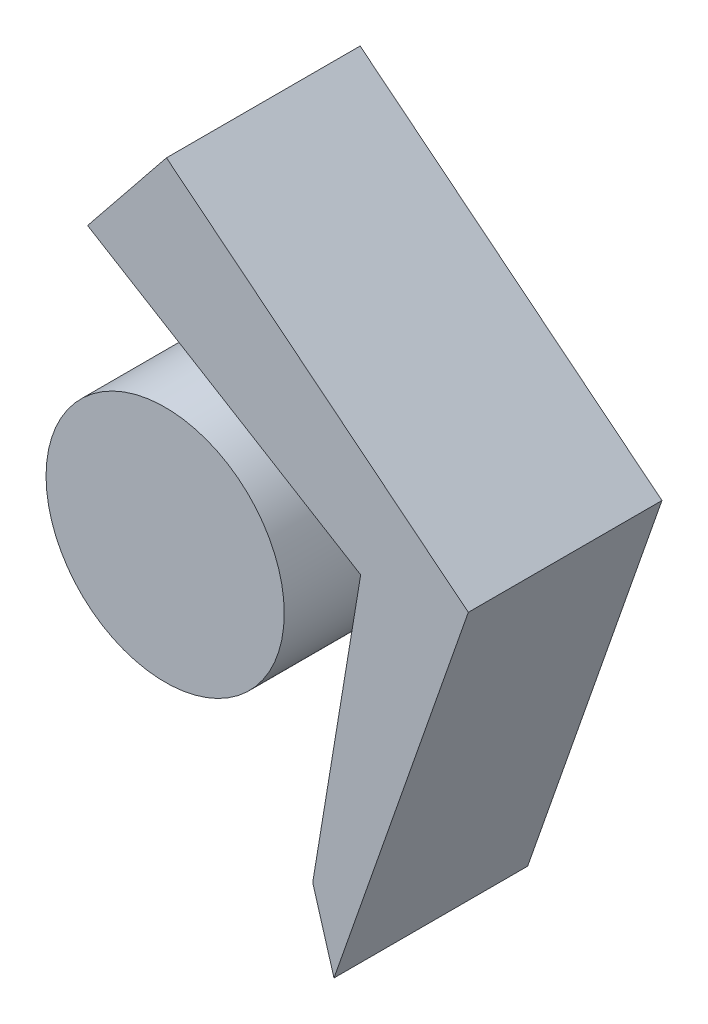
ISO-10303-21;
HEADER;
FILE_DESCRIPTION(('STEP AP214'),'2;1');
FILE_NAME('part.step','',(''),(''),'','','');
FILE_SCHEMA(('AUTOMOTIVE_DESIGN { 1 0 10303 214 1 1 1 1 }'));
ENDSEC;
DATA;
#1=APPLICATION_CONTEXT('core data for automotive mechanical design processes');
#2=APPLICATION_PROTOCOL_DEFINITION('international standard','automotive_design',2000,#1);
#3=PRODUCT_CONTEXT('',#1,'mechanical');
#4=PRODUCT('Part','Part','',(#3));
#5=PRODUCT_RELATED_PRODUCT_CATEGORY('part','',(#4));
#6=PRODUCT_DEFINITION_FORMATION('','',#4);
#7=PRODUCT_DEFINITION_CONTEXT('part definition',#1,'design');
#8=PRODUCT_DEFINITION('design','',#6,#7);
#9=PRODUCT_DEFINITION_SHAPE('','',#8);
#10=(LENGTH_UNIT() NAMED_UNIT(*) SI_UNIT(.MILLI.,.METRE.));
#11=(NAMED_UNIT(*) PLANE_ANGLE_UNIT() SI_UNIT($,.RADIAN.));
#12=(NAMED_UNIT(*) SI_UNIT($,.STERADIAN.) SOLID_ANGLE_UNIT());
#13=UNCERTAINTY_MEASURE_WITH_UNIT(LENGTH_MEASURE(1.E-05),#10,'distance_accuracy_value','');
#14=(GEOMETRIC_REPRESENTATION_CONTEXT(3) GLOBAL_UNCERTAINTY_ASSIGNED_CONTEXT((#13)) GLOBAL_UNIT_ASSIGNED_CONTEXT((#10,
#11,#12)) REPRESENTATION_CONTEXT('',''));
#15=CARTESIAN_POINT('',(0.,0.,0.));
#16=DIRECTION('',(0.,0.,1.));
#17=DIRECTION('',(1.,0.,0.));
#18=AXIS2_PLACEMENT_3D('',#15,#16,#17);
#19=CARTESIAN_POINT('',(-119.476957207787,-103.082546040325,200.));
#20=DIRECTION('',(0.,0.,-1.));
#21=DIRECTION('',(-1.,0.,0.));
#22=AXIS2_PLACEMENT_3D('',#19,#20,#21);
#23=CYLINDRICAL_SURFACE('',#22,123.);
#24=CARTESIAN_POINT('',(-119.476957207787,-103.082546040325,200.));
#25=DIRECTION('',(0.,0.,1.));
#26=DIRECTION('',(1.,0.,0.));
#27=AXIS2_PLACEMENT_3D('',#24,#25,#26);
#28=CIRCLE('',#27,123.);
#29=CARTESIAN_POINT('',(3.52304279221316,-103.082546040325,200.));
#30=VERTEX_POINT('',#29);
#31=EDGE_CURVE('E51',#30,#30,#28,.T.);
#32=ORIENTED_EDGE('',*,*,#31,.F.);
#33=EDGE_LOOP('',(#32));
#34=FACE_BOUND('',#33,.T.);
#35=CARTESIAN_POINT('',(-119.476957207787,-103.082546040325,0.));
#36=DIRECTION('',(0.,0.,1.));
#37=DIRECTION('',(1.,0.,0.));
#38=AXIS2_PLACEMENT_3D('',#35,#36,#37);
#39=CIRCLE('',#38,123.);
#40=CARTESIAN_POINT('',(3.52304279221316,-103.082546040325,0.));
#41=VERTEX_POINT('',#40);
#42=EDGE_CURVE('E11',#41,#41,#39,.T.);
#43=ORIENTED_EDGE('',*,*,#42,.T.);
#44=EDGE_LOOP('',(#43));
#45=FACE_BOUND('',#44,.T.);
#46=ADVANCED_FACE('F47',(#34,#45),#23,.T.);
#47=CARTESIAN_POINT('',(-119.476957207787,-103.082546040325,200.));
#48=DIRECTION('',(0.,0.,1.));
#49=DIRECTION('',(1.,0.,0.));
#50=AXIS2_PLACEMENT_3D('',#47,#48,#49);
#51=PLANE('',#50);
#52=ORIENTED_EDGE('',*,*,#31,.T.);
#53=EDGE_LOOP('',(#52));
#54=FACE_BOUND('',#53,.T.);
#55=ADVANCED_FACE('F49',(#54),#51,.T.);
#56=CARTESIAN_POINT('',(-119.476957207787,-103.082546040325,0.));
#57=DIRECTION('',(0.,0.,1.));
#58=DIRECTION('',(1.,0.,0.));
#59=AXIS2_PLACEMENT_3D('',#56,#57,#58);
#60=PLANE('',#59);
#61=ORIENTED_EDGE('',*,*,#42,.F.);
#62=EDGE_LOOP('',(#61));
#63=FACE_BOUND('',#62,.T.);
#64=ADVANCED_FACE('F66',(#63),#60,.F.);
#65=CLOSED_SHELL('',(#46,#55,#64));
#66=MANIFOLD_SOLID_BREP('B2',#65);
#67=CARTESIAN_POINT('',(-199.564691570749,142.381665238509,200.));
#68=DIRECTION('',(0.779303377510946,-0.626646827008669,0.));
#69=DIRECTION('',(0.626646827008669,0.779303377510946,0.));
#70=AXIS2_PLACEMENT_3D('',#67,#68,#69);
#71=PLANE('',#70);
#72=DIRECTION('',(-0.626646827008669,-0.779303377510946,0.));
#73=VECTOR('',#72,1.);
#74=CARTESIAN_POINT('',(-199.564691570749,142.381665238509,0.));
#75=LINE('',#74,#73);
#76=CARTESIAN_POINT('',(-118.100604059622,243.691104314932,0.));
#77=VERTEX_POINT('',#76);
#78=CARTESIAN_POINT('',(-199.564691570749,142.381665238509,0.));
#79=VERTEX_POINT('',#78);
#80=EDGE_CURVE('E178',#77,#79,#75,.T.);
#81=ORIENTED_EDGE('',*,*,#80,.T.);
#82=DIRECTION('',(0.,0.,-1.));
#83=VECTOR('',#82,1.);
#84=CARTESIAN_POINT('',(-199.564691570749,142.381665238509,200.));
#85=LINE('',#84,#83);
#86=CARTESIAN_POINT('',(-199.564691570749,142.381665238509,200.));
#87=VERTEX_POINT('',#86);
#88=EDGE_CURVE('E45',#87,#79,#85,.T.);
#89=ORIENTED_EDGE('',*,*,#88,.F.);
#90=DIRECTION('',(-0.626646827008669,-0.779303377510946,0.));
#91=VECTOR('',#90,1.);
#92=CARTESIAN_POINT('',(-199.564691570749,142.381665238509,200.));
#93=LINE('',#92,#91);
#94=CARTESIAN_POINT('',(-118.100604059622,243.691104314932,200.));
#95=VERTEX_POINT('',#94);
#96=EDGE_CURVE('E188',#95,#87,#93,.T.);
#97=ORIENTED_EDGE('',*,*,#96,.F.);
#98=DIRECTION('',(0.,0.,-1.));
#99=VECTOR('',#98,1.);
#100=CARTESIAN_POINT('',(-118.100604059622,243.691104314932,200.));
#101=LINE('',#100,#99);
#102=EDGE_CURVE('E174',#95,#77,#101,.T.);
#103=ORIENTED_EDGE('',*,*,#102,.T.);
#104=EDGE_LOOP('',(#81,#89,#97,#103));
#105=FACE_BOUND('',#104,.T.);
#106=ADVANCED_FACE('F94',(#105),#71,.F.);
#107=CARTESIAN_POINT('',(82.4662828011417,-28.9616436324293,200.));
#108=DIRECTION('',(0.519222148093754,0.854639316278457,0.));
#109=DIRECTION('',(-0.854639316278457,0.519222148093754,0.));
#110=AXIS2_PLACEMENT_3D('',#107,#108,#109);
#111=PLANE('',#110);
#112=DIRECTION('',(0.854639316278457,-0.519222148093754,0.));
#113=VECTOR('',#112,1.);
#114=CARTESIAN_POINT('',(82.4662828011417,-28.9616436324293,0.));
#115=LINE('',#114,#113);
#116=CARTESIAN_POINT('',(82.4662828011417,-28.9616436324293,0.));
#117=VERTEX_POINT('',#116);
#118=EDGE_CURVE('E181',#79,#117,#115,.T.);
#119=ORIENTED_EDGE('',*,*,#118,.T.);
#120=DIRECTION('',(0.,0.,-1.));
#121=VECTOR('',#120,1.);
#122=CARTESIAN_POINT('',(82.4662828011417,-28.9616436324293,200.));
#123=LINE('',#122,#121);
#124=CARTESIAN_POINT('',(82.4662828011417,-28.9616436324293,200.));
#125=VERTEX_POINT('',#124);
#126=EDGE_CURVE('E102',#125,#117,#123,.T.);
#127=ORIENTED_EDGE('',*,*,#126,.F.);
#128=DIRECTION('',(0.854639316278457,-0.519222148093754,0.));
#129=VECTOR('',#128,1.);
#130=CARTESIAN_POINT('',(82.4662828011417,-28.9616436324293,200.));
#131=LINE('',#130,#129);
#132=EDGE_CURVE('E147',#87,#125,#131,.T.);
#133=ORIENTED_EDGE('',*,*,#132,.F.);
#134=ORIENTED_EDGE('',*,*,#88,.T.);
#135=EDGE_LOOP('',(#119,#127,#133,#134));
#136=FACE_BOUND('',#135,.T.);
#137=ADVANCED_FACE('F212',(#136),#111,.F.);
#138=CARTESIAN_POINT('',(32.9336542123907,-328.961643632429,200.));
#139=DIRECTION('',(0.98664204860206,-0.162903247144834,0.));
#140=DIRECTION('',(0.162903247144834,0.98664204860206,0.));
#141=AXIS2_PLACEMENT_3D('',#138,#139,#140);
#142=PLANE('',#141);
#143=DIRECTION('',(-0.162903247144834,-0.98664204860206,0.));
#144=VECTOR('',#143,1.);
#145=CARTESIAN_POINT('',(32.9336542123907,-328.961643632429,0.));
#146=LINE('',#145,#144);
#147=CARTESIAN_POINT('',(32.9336542123907,-328.961643632429,0.));
#148=VERTEX_POINT('',#147);
#149=EDGE_CURVE('E183',#117,#148,#146,.T.);
#150=ORIENTED_EDGE('',*,*,#149,.T.);
#151=DIRECTION('',(0.,0.,-1.));
#152=VECTOR('',#151,1.);
#153=CARTESIAN_POINT('',(32.9336542123907,-328.961643632429,200.));
#154=LINE('',#153,#152);
#155=CARTESIAN_POINT('',(32.9336542123907,-328.961643632429,200.));
#156=VERTEX_POINT('',#155);
#157=EDGE_CURVE('E169',#156,#148,#154,.T.);
#158=ORIENTED_EDGE('',*,*,#157,.F.);
#159=DIRECTION('',(-0.162903247144834,-0.98664204860206,0.));
#160=VECTOR('',#159,1.);
#161=CARTESIAN_POINT('',(32.9336542123907,-328.961643632429,200.));
#162=LINE('',#161,#160);
#163=EDGE_CURVE('E160',#125,#156,#162,.T.);
#164=ORIENTED_EDGE('',*,*,#163,.F.);
#165=ORIENTED_EDGE('',*,*,#126,.T.);
#166=EDGE_LOOP('',(#150,#158,#164,#165));
#167=FACE_BOUND('',#166,.T.);
#168=ADVANCED_FACE('F194',(#167),#142,.F.);
#169=CARTESIAN_POINT('',(54.8961050001014,-403.39602319761,200.));
#170=DIRECTION('',(0.959121023523832,0.282996223004118,0.));
#171=DIRECTION('',(-0.282996223004118,0.959121023523832,0.));
#172=AXIS2_PLACEMENT_3D('',#169,#170,#171);
#173=PLANE('',#172);
#174=DIRECTION('',(0.282996223004118,-0.959121023523832,0.));
#175=VECTOR('',#174,1.);
#176=CARTESIAN_POINT('',(54.8961050001014,-403.39602319761,0.));
#177=LINE('',#176,#175);
#178=CARTESIAN_POINT('',(54.8961050001014,-403.39602319761,0.));
#179=VERTEX_POINT('',#178);
#180=EDGE_CURVE('E168',#148,#179,#177,.T.);
#181=ORIENTED_EDGE('',*,*,#180,.T.);
#182=DIRECTION('',(0.,0.,-1.));
#183=VECTOR('',#182,1.);
#184=CARTESIAN_POINT('',(54.8961050001014,-403.39602319761,200.));
#185=LINE('',#184,#183);
#186=CARTESIAN_POINT('',(54.8961050001014,-403.39602319761,200.));
#187=VERTEX_POINT('',#186);
#188=EDGE_CURVE('E165',#187,#179,#185,.T.);
#189=ORIENTED_EDGE('',*,*,#188,.F.);
#190=DIRECTION('',(0.282996223004118,-0.959121023523832,0.));
#191=VECTOR('',#190,1.);
#192=CARTESIAN_POINT('',(54.8961050001014,-403.39602319761,200.));
#193=LINE('',#192,#191);
#194=EDGE_CURVE('E154',#156,#187,#193,.T.);
#195=ORIENTED_EDGE('',*,*,#194,.F.);
#196=ORIENTED_EDGE('',*,*,#157,.T.);
#197=EDGE_LOOP('',(#181,#189,#195,#196));
#198=FACE_BOUND('',#197,.T.);
#199=ADVANCED_FACE('F166',(#198),#173,.F.);
#200=CARTESIAN_POINT('',(193.620746944756,-6.96762648853511,200.));
#201=DIRECTION('',(-0.943877135021606,0.330296766534892,0.));
#202=DIRECTION('',(-0.330296766534892,-0.943877135021606,0.));
#203=AXIS2_PLACEMENT_3D('',#200,#201,#202);
#204=PLANE('',#203);
#205=DIRECTION('',(0.330296766534892,0.943877135021606,0.));
#206=VECTOR('',#205,1.);
#207=CARTESIAN_POINT('',(193.620746944756,-6.96762648853511,0.));
#208=LINE('',#207,#206);
#209=CARTESIAN_POINT('',(193.620746944756,-6.96762648853511,0.));
#210=VERTEX_POINT('',#209);
#211=EDGE_CURVE('E133',#179,#210,#208,.T.);
#212=ORIENTED_EDGE('',*,*,#211,.T.);
#213=DIRECTION('',(0.,0.,-1.));
#214=VECTOR('',#213,1.);
#215=CARTESIAN_POINT('',(193.620746944756,-6.96762648853511,200.));
#216=LINE('',#215,#214);
#217=CARTESIAN_POINT('',(193.620746944756,-6.96762648853511,200.));
#218=VERTEX_POINT('',#217);
#219=EDGE_CURVE('E170',#218,#210,#216,.T.);
#220=ORIENTED_EDGE('',*,*,#219,.F.);
#221=DIRECTION('',(0.330296766534892,0.943877135021606,0.));
#222=VECTOR('',#221,1.);
#223=CARTESIAN_POINT('',(193.620746944756,-6.96762648853511,200.));
#224=LINE('',#223,#222);
#225=EDGE_CURVE('E158',#187,#218,#224,.T.);
#226=ORIENTED_EDGE('',*,*,#225,.F.);
#227=ORIENTED_EDGE('',*,*,#188,.T.);
#228=EDGE_LOOP('',(#212,#220,#226,#227));
#229=FACE_BOUND('',#228,.T.);
#230=ADVANCED_FACE('F172',(#229),#204,.F.);
#231=CARTESIAN_POINT('',(-118.100604059622,243.691104314932,200.));
#232=DIRECTION('',(-0.626646827008669,-0.779303377510946,0.));
#233=DIRECTION('',(0.779303377510946,-0.626646827008669,0.));
#234=AXIS2_PLACEMENT_3D('',#231,#232,#233);
#235=PLANE('',#234);
#236=DIRECTION('',(-0.779303377510946,0.626646827008669,0.));
#237=VECTOR('',#236,1.);
#238=CARTESIAN_POINT('',(-118.100604059622,243.691104314932,0.));
#239=LINE('',#238,#237);
#240=EDGE_CURVE('E139',#210,#77,#239,.T.);
#241=ORIENTED_EDGE('',*,*,#240,.T.);
#242=ORIENTED_EDGE('',*,*,#102,.F.);
#243=DIRECTION('',(-0.779303377510946,0.626646827008669,0.));
#244=VECTOR('',#243,1.);
#245=CARTESIAN_POINT('',(-118.100604059622,243.691104314932,200.));
#246=LINE('',#245,#244);
#247=EDGE_CURVE('E110',#218,#95,#246,.T.);
#248=ORIENTED_EDGE('',*,*,#247,.F.);
#249=ORIENTED_EDGE('',*,*,#219,.T.);
#250=EDGE_LOOP('',(#241,#242,#248,#249));
#251=FACE_BOUND('',#250,.T.);
#252=ADVANCED_FACE('F201',(#251),#235,.F.);
#253=CARTESIAN_POINT('',(0.,0.,200.));
#254=DIRECTION('',(0.,0.,-1.));
#255=DIRECTION('',(-1.,0.,0.));
#256=AXIS2_PLACEMENT_3D('',#253,#254,#255);
#257=PLANE('',#256);
#258=ORIENTED_EDGE('',*,*,#96,.T.);
#259=ORIENTED_EDGE('',*,*,#132,.T.);
#260=ORIENTED_EDGE('',*,*,#163,.T.);
#261=ORIENTED_EDGE('',*,*,#194,.T.);
#262=ORIENTED_EDGE('',*,*,#225,.T.);
#263=ORIENTED_EDGE('',*,*,#247,.T.);
#264=EDGE_LOOP('',(#258,#259,#260,#261,#262,#263));
#265=FACE_BOUND('',#264,.T.);
#266=ADVANCED_FACE('F156',(#265),#257,.F.);
#267=CARTESIAN_POINT('',(0.,0.,0.));
#268=DIRECTION('',(0.,0.,-1.));
#269=DIRECTION('',(-1.,0.,0.));
#270=AXIS2_PLACEMENT_3D('',#267,#268,#269);
#271=PLANE('',#270);
#272=ORIENTED_EDGE('',*,*,#80,.F.);
#273=ORIENTED_EDGE('',*,*,#240,.F.);
#274=ORIENTED_EDGE('',*,*,#211,.F.);
#275=ORIENTED_EDGE('',*,*,#180,.F.);
#276=ORIENTED_EDGE('',*,*,#149,.F.);
#277=ORIENTED_EDGE('',*,*,#118,.F.);
#278=EDGE_LOOP('',(#272,#273,#274,#275,#276,#277));
#279=FACE_BOUND('',#278,.T.);
#280=ADVANCED_FACE('F197',(#279),#271,.T.);
#281=CLOSED_SHELL('',(#106,#137,#168,#199,#230,#252,#266,#280));
#282=MANIFOLD_SOLID_BREP('B6',#281);
#283=ADVANCED_BREP_SHAPE_REPRESENTATION('',(#18,#66,#282),#14);
#284=SHAPE_DEFINITION_REPRESENTATION(#9,#283);
ENDSEC;
END-ISO-10303-21;
